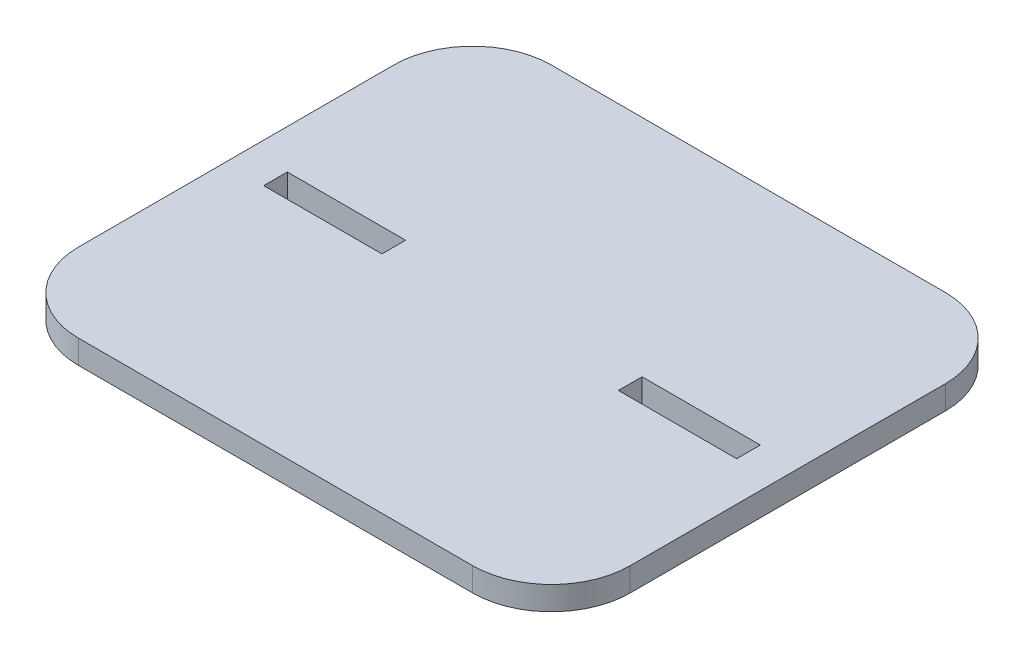
ISO-10303-21;
HEADER;
FILE_DESCRIPTION(('STEP AP214'),'2;1');
FILE_NAME('part.step','',(''),(''),'','','');
FILE_SCHEMA(('AUTOMOTIVE_DESIGN { 1 0 10303 214 1 1 1 1 }'));
ENDSEC;
DATA;
#1=APPLICATION_CONTEXT('core data for automotive mechanical design processes');
#2=APPLICATION_PROTOCOL_DEFINITION('international standard','automotive_design',2000,#1);
#3=PRODUCT_CONTEXT('',#1,'mechanical');
#4=PRODUCT('Part','Part','',(#3));
#5=PRODUCT_RELATED_PRODUCT_CATEGORY('part','',(#4));
#6=PRODUCT_DEFINITION_FORMATION('','',#4);
#7=PRODUCT_DEFINITION_CONTEXT('part definition',#1,'design');
#8=PRODUCT_DEFINITION('design','',#6,#7);
#9=PRODUCT_DEFINITION_SHAPE('','',#8);
#10=(LENGTH_UNIT() NAMED_UNIT(*) SI_UNIT(.MILLI.,.METRE.));
#11=(NAMED_UNIT(*) PLANE_ANGLE_UNIT() SI_UNIT($,.RADIAN.));
#12=(NAMED_UNIT(*) SI_UNIT($,.STERADIAN.) SOLID_ANGLE_UNIT());
#13=UNCERTAINTY_MEASURE_WITH_UNIT(LENGTH_MEASURE(1.E-05),#10,'distance_accuracy_value','');
#14=(GEOMETRIC_REPRESENTATION_CONTEXT(3) GLOBAL_UNCERTAINTY_ASSIGNED_CONTEXT((#13)) GLOBAL_UNIT_ASSIGNED_CONTEXT((#10,
#11,#12)) REPRESENTATION_CONTEXT('',''));
#15=CARTESIAN_POINT('',(0.,0.,0.));
#16=DIRECTION('',(0.,0.,1.));
#17=DIRECTION('',(1.,0.,0.));
#18=AXIS2_PLACEMENT_3D('',#15,#16,#17);
#19=CARTESIAN_POINT('',(60.,3.,-50.));
#20=DIRECTION('',(0.,-1.,0.));
#21=DIRECTION('',(0.,0.,-1.));
#22=AXIS2_PLACEMENT_3D('',#19,#20,#21);
#23=PLANE('',#22);
#24=DIRECTION('',(0.,0.,-1.));
#25=VECTOR('',#24,1.);
#26=CARTESIAN_POINT('',(20.,3.,-31.5));
#27=LINE('',#26,#25);
#28=CARTESIAN_POINT('',(20.,3.,-28.5));
#29=VERTEX_POINT('',#28);
#30=CARTESIAN_POINT('',(20.,3.,-31.5));
#31=VERTEX_POINT('',#30);
#32=EDGE_CURVE('E182',#29,#31,#27,.T.);
#33=ORIENTED_EDGE('',*,*,#32,.F.);
#34=DIRECTION('',(1.,0.,0.));
#35=VECTOR('',#34,1.);
#36=CARTESIAN_POINT('',(5.,3.,-28.5));
#37=LINE('',#36,#35);
#38=CARTESIAN_POINT('',(5.,3.,-28.5));
#39=VERTEX_POINT('',#38);
#40=EDGE_CURVE('E190',#39,#29,#37,.T.);
#41=ORIENTED_EDGE('',*,*,#40,.F.);
#42=DIRECTION('',(0.,0.,1.));
#43=VECTOR('',#42,1.);
#44=CARTESIAN_POINT('',(5.,3.,-31.5));
#45=LINE('',#44,#43);
#46=CARTESIAN_POINT('',(5.,3.,-31.5));
#47=VERTEX_POINT('',#46);
#48=EDGE_CURVE('E187',#47,#39,#45,.T.);
#49=ORIENTED_EDGE('',*,*,#48,.F.);
#50=DIRECTION('',(-1.,0.,0.));
#51=VECTOR('',#50,1.);
#52=CARTESIAN_POINT('',(5.,3.,-31.5));
#53=LINE('',#52,#51);
#54=EDGE_CURVE('E184',#31,#47,#53,.T.);
#55=ORIENTED_EDGE('',*,*,#54,.F.);
#56=EDGE_LOOP('',(#33,#41,#49,#55));
#57=FACE_BOUND('',#56,.T.);
#58=CARTESIAN_POINT('',(60.,3.,-50.));
#59=DIRECTION('',(0.,1.,0.));
#60=DIRECTION('',(0.,0.,-1.));
#61=AXIS2_PLACEMENT_3D('',#58,#59,#60);
#62=CIRCLE('',#61,10.);
#63=CARTESIAN_POINT('',(70.,3.,-50.));
#64=VERTEX_POINT('',#63);
#65=CARTESIAN_POINT('',(60.,3.,-60.));
#66=VERTEX_POINT('',#65);
#67=EDGE_CURVE('E213',#64,#66,#62,.T.);
#68=ORIENTED_EDGE('',*,*,#67,.T.);
#69=DIRECTION('',(-1.,0.,0.));
#70=VECTOR('',#69,1.);
#71=CARTESIAN_POINT('',(10.0000000000001,3.,-60.));
#72=LINE('',#71,#70);
#73=CARTESIAN_POINT('',(10.0000000000001,3.,-60.));
#74=VERTEX_POINT('',#73);
#75=EDGE_CURVE('E216',#66,#74,#72,.T.);
#76=ORIENTED_EDGE('',*,*,#75,.T.);
#77=CARTESIAN_POINT('',(10.,3.,-50.));
#78=DIRECTION('',(0.,1.,0.));
#79=DIRECTION('',(0.,0.,-1.));
#80=AXIS2_PLACEMENT_3D('',#77,#78,#79);
#81=CIRCLE('',#80,10.);
#82=CARTESIAN_POINT('',(0.,3.,-49.9999999999999));
#83=VERTEX_POINT('',#82);
#84=EDGE_CURVE('E219',#74,#83,#81,.T.);
#85=ORIENTED_EDGE('',*,*,#84,.T.);
#86=DIRECTION('',(0.,0.,1.));
#87=VECTOR('',#86,1.);
#88=CARTESIAN_POINT('',(0.,3.,-10.0000000000001));
#89=LINE('',#88,#87);
#90=CARTESIAN_POINT('',(0.,3.,-10.0000000000001));
#91=VERTEX_POINT('',#90);
#92=EDGE_CURVE('E221',#83,#91,#89,.T.);
#93=ORIENTED_EDGE('',*,*,#92,.T.);
#94=CARTESIAN_POINT('',(10.,3.,-10.));
#95=DIRECTION('',(0.,1.,0.));
#96=DIRECTION('',(0.,0.,-1.));
#97=AXIS2_PLACEMENT_3D('',#94,#95,#96);
#98=CIRCLE('',#97,10.);
#99=CARTESIAN_POINT('',(10.0000000000001,3.,0.));
#100=VERTEX_POINT('',#99);
#101=EDGE_CURVE('E223',#91,#100,#98,.T.);
#102=ORIENTED_EDGE('',*,*,#101,.T.);
#103=DIRECTION('',(1.,0.,0.));
#104=VECTOR('',#103,1.);
#105=CARTESIAN_POINT('',(10.0000000000001,3.,0.));
#106=LINE('',#105,#104);
#107=CARTESIAN_POINT('',(60.,3.,0.));
#108=VERTEX_POINT('',#107);
#109=EDGE_CURVE('E225',#100,#108,#106,.T.);
#110=ORIENTED_EDGE('',*,*,#109,.T.);
#111=CARTESIAN_POINT('',(60.,3.,-10.));
#112=DIRECTION('',(0.,1.,0.));
#113=DIRECTION('',(0.,0.,1.));
#114=AXIS2_PLACEMENT_3D('',#111,#112,#113);
#115=CIRCLE('',#114,10.);
#116=CARTESIAN_POINT('',(70.,3.,-10.));
#117=VERTEX_POINT('',#116);
#118=EDGE_CURVE('E227',#108,#117,#115,.T.);
#119=ORIENTED_EDGE('',*,*,#118,.T.);
#120=DIRECTION('',(0.,0.,-1.));
#121=VECTOR('',#120,1.);
#122=CARTESIAN_POINT('',(70.,3.,-10.));
#123=LINE('',#122,#121);
#124=EDGE_CURVE('E229',#117,#64,#123,.T.);
#125=ORIENTED_EDGE('',*,*,#124,.T.);
#126=EDGE_LOOP('',(#68,#76,#85,#93,#102,#110,#119,#125));
#127=FACE_BOUND('',#126,.T.);
#128=DIRECTION('',(0.,0.,-1.));
#129=VECTOR('',#128,1.);
#130=CARTESIAN_POINT('',(65.,3.,-31.5));
#131=LINE('',#130,#129);
#132=CARTESIAN_POINT('',(65.,3.,-28.5));
#133=VERTEX_POINT('',#132);
#134=CARTESIAN_POINT('',(65.,3.,-31.5));
#135=VERTEX_POINT('',#134);
#136=EDGE_CURVE('E146',#133,#135,#131,.T.);
#137=ORIENTED_EDGE('',*,*,#136,.F.);
#138=DIRECTION('',(1.,0.,0.));
#139=VECTOR('',#138,1.);
#140=CARTESIAN_POINT('',(50.,3.,-28.5));
#141=LINE('',#140,#139);
#142=CARTESIAN_POINT('',(50.,3.,-28.5));
#143=VERTEX_POINT('',#142);
#144=EDGE_CURVE('E168',#143,#133,#141,.T.);
#145=ORIENTED_EDGE('',*,*,#144,.F.);
#146=DIRECTION('',(0.,0.,1.));
#147=VECTOR('',#146,1.);
#148=CARTESIAN_POINT('',(50.,3.,-31.5));
#149=LINE('',#148,#147);
#150=CARTESIAN_POINT('',(50.,3.,-31.5));
#151=VERTEX_POINT('',#150);
#152=EDGE_CURVE('E166',#151,#143,#149,.T.);
#153=ORIENTED_EDGE('',*,*,#152,.F.);
#154=DIRECTION('',(-1.,0.,0.));
#155=VECTOR('',#154,1.);
#156=CARTESIAN_POINT('',(50.,3.,-31.5));
#157=LINE('',#156,#155);
#158=EDGE_CURVE('E154',#135,#151,#157,.T.);
#159=ORIENTED_EDGE('',*,*,#158,.F.);
#160=EDGE_LOOP('',(#137,#145,#153,#159));
#161=FACE_BOUND('',#160,.T.);
#162=ADVANCED_FACE('F33',(#57,#127,#161),#23,.F.);
#163=CARTESIAN_POINT('',(60.,0.,-50.));
#164=DIRECTION('',(0.,-1.,0.));
#165=DIRECTION('',(0.,0.,-1.));
#166=AXIS2_PLACEMENT_3D('',#163,#164,#165);
#167=PLANE('',#166);
#168=CARTESIAN_POINT('',(60.,0.,-50.));
#169=DIRECTION('',(0.,1.,0.));
#170=DIRECTION('',(0.,0.,-1.));
#171=AXIS2_PLACEMENT_3D('',#168,#169,#170);
#172=CIRCLE('',#171,10.);
#173=CARTESIAN_POINT('',(70.,0.,-50.));
#174=VERTEX_POINT('',#173);
#175=CARTESIAN_POINT('',(60.,0.,-60.));
#176=VERTEX_POINT('',#175);
#177=EDGE_CURVE('E212',#174,#176,#172,.T.);
#178=ORIENTED_EDGE('',*,*,#177,.F.);
#179=DIRECTION('',(0.,0.,-1.));
#180=VECTOR('',#179,1.);
#181=CARTESIAN_POINT('',(70.,0.,-10.));
#182=LINE('',#181,#180);
#183=CARTESIAN_POINT('',(70.,0.,-10.));
#184=VERTEX_POINT('',#183);
#185=EDGE_CURVE('E217',#184,#174,#182,.T.);
#186=ORIENTED_EDGE('',*,*,#185,.F.);
#187=CARTESIAN_POINT('',(60.,0.,-10.));
#188=DIRECTION('',(0.,1.,0.));
#189=DIRECTION('',(0.,0.,1.));
#190=AXIS2_PLACEMENT_3D('',#187,#188,#189);
#191=CIRCLE('',#190,10.);
#192=CARTESIAN_POINT('',(60.,0.,0.));
#193=VERTEX_POINT('',#192);
#194=EDGE_CURVE('E244',#193,#184,#191,.T.);
#195=ORIENTED_EDGE('',*,*,#194,.F.);
#196=DIRECTION('',(1.,0.,0.));
#197=VECTOR('',#196,1.);
#198=CARTESIAN_POINT('',(10.0000000000001,0.,0.));
#199=LINE('',#198,#197);
#200=CARTESIAN_POINT('',(10.0000000000001,0.,0.));
#201=VERTEX_POINT('',#200);
#202=EDGE_CURVE('E242',#201,#193,#199,.T.);
#203=ORIENTED_EDGE('',*,*,#202,.F.);
#204=CARTESIAN_POINT('',(10.,0.,-10.));
#205=DIRECTION('',(0.,1.,0.));
#206=DIRECTION('',(0.,0.,-1.));
#207=AXIS2_PLACEMENT_3D('',#204,#205,#206);
#208=CIRCLE('',#207,10.);
#209=CARTESIAN_POINT('',(0.,0.,-10.0000000000001));
#210=VERTEX_POINT('',#209);
#211=EDGE_CURVE('E240',#210,#201,#208,.T.);
#212=ORIENTED_EDGE('',*,*,#211,.F.);
#213=DIRECTION('',(0.,0.,1.));
#214=VECTOR('',#213,1.);
#215=CARTESIAN_POINT('',(0.,0.,-10.0000000000001));
#216=LINE('',#215,#214);
#217=CARTESIAN_POINT('',(0.,0.,-49.9999999999999));
#218=VERTEX_POINT('',#217);
#219=EDGE_CURVE('E238',#218,#210,#216,.T.);
#220=ORIENTED_EDGE('',*,*,#219,.F.);
#221=CARTESIAN_POINT('',(10.,0.,-50.));
#222=DIRECTION('',(0.,1.,0.));
#223=DIRECTION('',(0.,0.,-1.));
#224=AXIS2_PLACEMENT_3D('',#221,#222,#223);
#225=CIRCLE('',#224,10.);
#226=CARTESIAN_POINT('',(10.0000000000001,0.,-60.));
#227=VERTEX_POINT('',#226);
#228=EDGE_CURVE('E236',#227,#218,#225,.T.);
#229=ORIENTED_EDGE('',*,*,#228,.F.);
#230=DIRECTION('',(-1.,0.,0.));
#231=VECTOR('',#230,1.);
#232=CARTESIAN_POINT('',(10.0000000000001,0.,-60.));
#233=LINE('',#232,#231);
#234=EDGE_CURVE('E234',#176,#227,#233,.T.);
#235=ORIENTED_EDGE('',*,*,#234,.F.);
#236=EDGE_LOOP('',(#178,#186,#195,#203,#212,#220,#229,#235));
#237=FACE_BOUND('',#236,.T.);
#238=DIRECTION('',(1.,0.,0.));
#239=VECTOR('',#238,1.);
#240=CARTESIAN_POINT('',(5.,0.,-28.5));
#241=LINE('',#240,#239);
#242=CARTESIAN_POINT('',(5.,0.,-28.5));
#243=VERTEX_POINT('',#242);
#244=CARTESIAN_POINT('',(20.,0.,-28.5));
#245=VERTEX_POINT('',#244);
#246=EDGE_CURVE('E185',#243,#245,#241,.T.);
#247=ORIENTED_EDGE('',*,*,#246,.T.);
#248=DIRECTION('',(0.,0.,-1.));
#249=VECTOR('',#248,1.);
#250=CARTESIAN_POINT('',(20.,0.,-31.5));
#251=LINE('',#250,#249);
#252=CARTESIAN_POINT('',(20.,0.,-31.5));
#253=VERTEX_POINT('',#252);
#254=EDGE_CURVE('E162',#245,#253,#251,.T.);
#255=ORIENTED_EDGE('',*,*,#254,.T.);
#256=DIRECTION('',(-1.,0.,0.));
#257=VECTOR('',#256,1.);
#258=CARTESIAN_POINT('',(5.,0.,-31.5));
#259=LINE('',#258,#257);
#260=CARTESIAN_POINT('',(5.,0.,-31.5));
#261=VERTEX_POINT('',#260);
#262=EDGE_CURVE('E195',#253,#261,#259,.T.);
#263=ORIENTED_EDGE('',*,*,#262,.T.);
#264=DIRECTION('',(0.,0.,1.));
#265=VECTOR('',#264,1.);
#266=CARTESIAN_POINT('',(5.,0.,-31.5));
#267=LINE('',#266,#265);
#268=EDGE_CURVE('E198',#261,#243,#267,.T.);
#269=ORIENTED_EDGE('',*,*,#268,.T.);
#270=EDGE_LOOP('',(#247,#255,#263,#269));
#271=FACE_BOUND('',#270,.T.);
#272=DIRECTION('',(1.,0.,0.));
#273=VECTOR('',#272,1.);
#274=CARTESIAN_POINT('',(50.,0.,-28.5));
#275=LINE('',#274,#273);
#276=CARTESIAN_POINT('',(50.,0.,-28.5));
#277=VERTEX_POINT('',#276);
#278=CARTESIAN_POINT('',(65.,0.,-28.5));
#279=VERTEX_POINT('',#278);
#280=EDGE_CURVE('E155',#277,#279,#275,.T.);
#281=ORIENTED_EDGE('',*,*,#280,.T.);
#282=DIRECTION('',(0.,0.,-1.));
#283=VECTOR('',#282,1.);
#284=CARTESIAN_POINT('',(65.,0.,-31.5));
#285=LINE('',#284,#283);
#286=CARTESIAN_POINT('',(65.,0.,-31.5));
#287=VERTEX_POINT('',#286);
#288=EDGE_CURVE('E56',#279,#287,#285,.T.);
#289=ORIENTED_EDGE('',*,*,#288,.T.);
#290=DIRECTION('',(-1.,0.,0.));
#291=VECTOR('',#290,1.);
#292=CARTESIAN_POINT('',(50.,0.,-31.5));
#293=LINE('',#292,#291);
#294=CARTESIAN_POINT('',(50.,0.,-31.5));
#295=VERTEX_POINT('',#294);
#296=EDGE_CURVE('E161',#287,#295,#293,.T.);
#297=ORIENTED_EDGE('',*,*,#296,.T.);
#298=DIRECTION('',(0.,0.,1.));
#299=VECTOR('',#298,1.);
#300=CARTESIAN_POINT('',(50.,0.,-31.5));
#301=LINE('',#300,#299);
#302=EDGE_CURVE('E174',#295,#277,#301,.T.);
#303=ORIENTED_EDGE('',*,*,#302,.T.);
#304=EDGE_LOOP('',(#281,#289,#297,#303));
#305=FACE_BOUND('',#304,.T.);
#306=ADVANCED_FACE('F274',(#237,#271,#305),#167,.T.);
#307=CARTESIAN_POINT('',(60.,3.,-50.));
#308=DIRECTION('',(0.,-1.,0.));
#309=DIRECTION('',(0.,0.,-1.));
#310=AXIS2_PLACEMENT_3D('',#307,#308,#309);
#311=CYLINDRICAL_SURFACE('',#310,10.);
#312=ORIENTED_EDGE('',*,*,#177,.T.);
#313=DIRECTION('',(0.,-1.,0.));
#314=VECTOR('',#313,1.);
#315=CARTESIAN_POINT('',(60.,3.,-60.));
#316=LINE('',#315,#314);
#317=EDGE_CURVE('E11',#66,#176,#316,.T.);
#318=ORIENTED_EDGE('',*,*,#317,.F.);
#319=ORIENTED_EDGE('',*,*,#67,.F.);
#320=DIRECTION('',(0.,-1.,0.));
#321=VECTOR('',#320,1.);
#322=CARTESIAN_POINT('',(70.,3.,-50.));
#323=LINE('',#322,#321);
#324=EDGE_CURVE('E231',#64,#174,#323,.T.);
#325=ORIENTED_EDGE('',*,*,#324,.T.);
#326=EDGE_LOOP('',(#312,#318,#319,#325));
#327=FACE_BOUND('',#326,.T.);
#328=ADVANCED_FACE('F35',(#327),#311,.T.);
#329=CARTESIAN_POINT('',(10.0000000000001,3.,-60.));
#330=DIRECTION('',(0.,0.,1.));
#331=DIRECTION('',(1.,0.,0.));
#332=AXIS2_PLACEMENT_3D('',#329,#330,#331);
#333=PLANE('',#332);
#334=ORIENTED_EDGE('',*,*,#234,.T.);
#335=DIRECTION('',(0.,-1.,0.));
#336=VECTOR('',#335,1.);
#337=CARTESIAN_POINT('',(10.0000000000001,3.,-60.));
#338=LINE('',#337,#336);
#339=EDGE_CURVE('E41',#74,#227,#338,.T.);
#340=ORIENTED_EDGE('',*,*,#339,.F.);
#341=ORIENTED_EDGE('',*,*,#75,.F.);
#342=ORIENTED_EDGE('',*,*,#317,.T.);
#343=EDGE_LOOP('',(#334,#340,#341,#342));
#344=FACE_BOUND('',#343,.T.);
#345=ADVANCED_FACE('F291',(#344),#333,.F.);
#346=CARTESIAN_POINT('',(10.,3.,-50.));
#347=DIRECTION('',(0.,-1.,0.));
#348=DIRECTION('',(0.,0.,-1.));
#349=AXIS2_PLACEMENT_3D('',#346,#347,#348);
#350=CYLINDRICAL_SURFACE('',#349,10.);
#351=ORIENTED_EDGE('',*,*,#228,.T.);
#352=DIRECTION('',(0.,-1.,0.));
#353=VECTOR('',#352,1.);
#354=CARTESIAN_POINT('',(0.,3.,-49.9999999999999));
#355=LINE('',#354,#353);
#356=EDGE_CURVE('E261',#83,#218,#355,.T.);
#357=ORIENTED_EDGE('',*,*,#356,.F.);
#358=ORIENTED_EDGE('',*,*,#84,.F.);
#359=ORIENTED_EDGE('',*,*,#339,.T.);
#360=EDGE_LOOP('',(#351,#357,#358,#359));
#361=FACE_BOUND('',#360,.T.);
#362=ADVANCED_FACE('F268',(#361),#350,.T.);
#363=CARTESIAN_POINT('',(0.,3.,-10.0000000000001));
#364=DIRECTION('',(1.,0.,0.));
#365=DIRECTION('',(0.,0.,-1.));
#366=AXIS2_PLACEMENT_3D('',#363,#364,#365);
#367=PLANE('',#366);
#368=ORIENTED_EDGE('',*,*,#219,.T.);
#369=DIRECTION('',(0.,-1.,0.));
#370=VECTOR('',#369,1.);
#371=CARTESIAN_POINT('',(0.,3.,-10.0000000000001));
#372=LINE('',#371,#370);
#373=EDGE_CURVE('E258',#91,#210,#372,.T.);
#374=ORIENTED_EDGE('',*,*,#373,.F.);
#375=ORIENTED_EDGE('',*,*,#92,.F.);
#376=ORIENTED_EDGE('',*,*,#356,.T.);
#377=EDGE_LOOP('',(#368,#374,#375,#376));
#378=FACE_BOUND('',#377,.T.);
#379=ADVANCED_FACE('F280',(#378),#367,.F.);
#380=CARTESIAN_POINT('',(10.,3.,-10.));
#381=DIRECTION('',(0.,-1.,0.));
#382=DIRECTION('',(0.,0.,-1.));
#383=AXIS2_PLACEMENT_3D('',#380,#381,#382);
#384=CYLINDRICAL_SURFACE('',#383,10.);
#385=ORIENTED_EDGE('',*,*,#211,.T.);
#386=DIRECTION('',(0.,-1.,0.));
#387=VECTOR('',#386,1.);
#388=CARTESIAN_POINT('',(10.0000000000001,3.,0.));
#389=LINE('',#388,#387);
#390=EDGE_CURVE('E255',#100,#201,#389,.T.);
#391=ORIENTED_EDGE('',*,*,#390,.F.);
#392=ORIENTED_EDGE('',*,*,#101,.F.);
#393=ORIENTED_EDGE('',*,*,#373,.T.);
#394=EDGE_LOOP('',(#385,#391,#392,#393));
#395=FACE_BOUND('',#394,.T.);
#396=ADVANCED_FACE('F284',(#395),#384,.T.);
#397=CARTESIAN_POINT('',(10.0000000000001,3.,0.));
#398=DIRECTION('',(0.,0.,-1.));
#399=DIRECTION('',(-1.,0.,0.));
#400=AXIS2_PLACEMENT_3D('',#397,#398,#399);
#401=PLANE('',#400);
#402=ORIENTED_EDGE('',*,*,#202,.T.);
#403=DIRECTION('',(0.,-1.,0.));
#404=VECTOR('',#403,1.);
#405=CARTESIAN_POINT('',(60.,3.,0.));
#406=LINE('',#405,#404);
#407=EDGE_CURVE('E252',#108,#193,#406,.T.);
#408=ORIENTED_EDGE('',*,*,#407,.F.);
#409=ORIENTED_EDGE('',*,*,#109,.F.);
#410=ORIENTED_EDGE('',*,*,#390,.T.);
#411=EDGE_LOOP('',(#402,#408,#409,#410));
#412=FACE_BOUND('',#411,.T.);
#413=ADVANCED_FACE('F304',(#412),#401,.F.);
#414=CARTESIAN_POINT('',(60.,3.,-10.));
#415=DIRECTION('',(0.,-1.,0.));
#416=DIRECTION('',(0.,0.,-1.));
#417=AXIS2_PLACEMENT_3D('',#414,#415,#416);
#418=CYLINDRICAL_SURFACE('',#417,10.);
#419=ORIENTED_EDGE('',*,*,#194,.T.);
#420=DIRECTION('',(0.,-1.,0.));
#421=VECTOR('',#420,1.);
#422=CARTESIAN_POINT('',(70.,3.,-10.));
#423=LINE('',#422,#421);
#424=EDGE_CURVE('E249',#117,#184,#423,.T.);
#425=ORIENTED_EDGE('',*,*,#424,.F.);
#426=ORIENTED_EDGE('',*,*,#118,.F.);
#427=ORIENTED_EDGE('',*,*,#407,.T.);
#428=EDGE_LOOP('',(#419,#425,#426,#427));
#429=FACE_BOUND('',#428,.T.);
#430=ADVANCED_FACE('F302',(#429),#418,.T.);
#431=CARTESIAN_POINT('',(70.,3.,-10.));
#432=DIRECTION('',(-1.,0.,0.));
#433=DIRECTION('',(0.,0.,1.));
#434=AXIS2_PLACEMENT_3D('',#431,#432,#433);
#435=PLANE('',#434);
#436=ORIENTED_EDGE('',*,*,#185,.T.);
#437=ORIENTED_EDGE('',*,*,#324,.F.);
#438=ORIENTED_EDGE('',*,*,#124,.F.);
#439=ORIENTED_EDGE('',*,*,#424,.T.);
#440=EDGE_LOOP('',(#436,#437,#438,#439));
#441=FACE_BOUND('',#440,.T.);
#442=ADVANCED_FACE('F297',(#441),#435,.F.);
#443=CARTESIAN_POINT('',(20.,3.,-31.5));
#444=DIRECTION('',(-1.,0.,0.));
#445=DIRECTION('',(0.,0.,1.));
#446=AXIS2_PLACEMENT_3D('',#443,#444,#445);
#447=PLANE('',#446);
#448=ORIENTED_EDGE('',*,*,#254,.F.);
#449=DIRECTION('',(0.,-1.,0.));
#450=VECTOR('',#449,1.);
#451=CARTESIAN_POINT('',(20.,3.,-28.5));
#452=LINE('',#451,#450);
#453=EDGE_CURVE('E192',#29,#245,#452,.T.);
#454=ORIENTED_EDGE('',*,*,#453,.F.);
#455=ORIENTED_EDGE('',*,*,#32,.T.);
#456=DIRECTION('',(0.,-1.,0.));
#457=VECTOR('',#456,1.);
#458=CARTESIAN_POINT('',(20.,3.,-31.5));
#459=LINE('',#458,#457);
#460=EDGE_CURVE('E209',#31,#253,#459,.T.);
#461=ORIENTED_EDGE('',*,*,#460,.T.);
#462=EDGE_LOOP('',(#448,#454,#455,#461));
#463=FACE_BOUND('',#462,.T.);
#464=ADVANCED_FACE('F322',(#463),#447,.T.);
#465=CARTESIAN_POINT('',(5.,3.,-31.5));
#466=DIRECTION('',(0.,0.,1.));
#467=DIRECTION('',(1.,0.,0.));
#468=AXIS2_PLACEMENT_3D('',#465,#466,#467);
#469=PLANE('',#468);
#470=ORIENTED_EDGE('',*,*,#262,.F.);
#471=ORIENTED_EDGE('',*,*,#460,.F.);
#472=ORIENTED_EDGE('',*,*,#54,.T.);
#473=DIRECTION('',(0.,-1.,0.));
#474=VECTOR('',#473,1.);
#475=CARTESIAN_POINT('',(5.,3.,-31.5));
#476=LINE('',#475,#474);
#477=EDGE_CURVE('E207',#47,#261,#476,.T.);
#478=ORIENTED_EDGE('',*,*,#477,.T.);
#479=EDGE_LOOP('',(#470,#471,#472,#478));
#480=FACE_BOUND('',#479,.T.);
#481=ADVANCED_FACE('F329',(#480),#469,.T.);
#482=CARTESIAN_POINT('',(5.,3.,-31.5));
#483=DIRECTION('',(1.,0.,0.));
#484=DIRECTION('',(0.,0.,-1.));
#485=AXIS2_PLACEMENT_3D('',#482,#483,#484);
#486=PLANE('',#485);
#487=ORIENTED_EDGE('',*,*,#268,.F.);
#488=ORIENTED_EDGE('',*,*,#477,.F.);
#489=ORIENTED_EDGE('',*,*,#48,.T.);
#490=DIRECTION('',(0.,-1.,0.));
#491=VECTOR('',#490,1.);
#492=CARTESIAN_POINT('',(5.,3.,-28.5));
#493=LINE('',#492,#491);
#494=EDGE_CURVE('E205',#39,#243,#493,.T.);
#495=ORIENTED_EDGE('',*,*,#494,.T.);
#496=EDGE_LOOP('',(#487,#488,#489,#495));
#497=FACE_BOUND('',#496,.T.);
#498=ADVANCED_FACE('F334',(#497),#486,.T.);
#499=CARTESIAN_POINT('',(5.,3.,-28.5));
#500=DIRECTION('',(0.,0.,-1.));
#501=DIRECTION('',(-1.,0.,0.));
#502=AXIS2_PLACEMENT_3D('',#499,#500,#501);
#503=PLANE('',#502);
#504=ORIENTED_EDGE('',*,*,#246,.F.);
#505=ORIENTED_EDGE('',*,*,#494,.F.);
#506=ORIENTED_EDGE('',*,*,#40,.T.);
#507=ORIENTED_EDGE('',*,*,#453,.T.);
#508=EDGE_LOOP('',(#504,#505,#506,#507));
#509=FACE_BOUND('',#508,.T.);
#510=ADVANCED_FACE('F340',(#509),#503,.T.);
#511=CARTESIAN_POINT('',(65.,3.,-31.5));
#512=DIRECTION('',(-1.,0.,0.));
#513=DIRECTION('',(0.,0.,1.));
#514=AXIS2_PLACEMENT_3D('',#511,#512,#513);
#515=PLANE('',#514);
#516=ORIENTED_EDGE('',*,*,#288,.F.);
#517=DIRECTION('',(0.,-1.,0.));
#518=VECTOR('',#517,1.);
#519=CARTESIAN_POINT('',(65.,3.,-28.5));
#520=LINE('',#519,#518);
#521=EDGE_CURVE('E150',#133,#279,#520,.T.);
#522=ORIENTED_EDGE('',*,*,#521,.F.);
#523=ORIENTED_EDGE('',*,*,#136,.T.);
#524=DIRECTION('',(0.,-1.,0.));
#525=VECTOR('',#524,1.);
#526=CARTESIAN_POINT('',(65.,3.,-31.5));
#527=LINE('',#526,#525);
#528=EDGE_CURVE('E149',#135,#287,#527,.T.);
#529=ORIENTED_EDGE('',*,*,#528,.T.);
#530=EDGE_LOOP('',(#516,#522,#523,#529));
#531=FACE_BOUND('',#530,.T.);
#532=ADVANCED_FACE('F148',(#531),#515,.T.);
#533=CARTESIAN_POINT('',(50.,3.,-31.5));
#534=DIRECTION('',(0.,0.,1.));
#535=DIRECTION('',(1.,0.,0.));
#536=AXIS2_PLACEMENT_3D('',#533,#534,#535);
#537=PLANE('',#536);
#538=ORIENTED_EDGE('',*,*,#296,.F.);
#539=ORIENTED_EDGE('',*,*,#528,.F.);
#540=ORIENTED_EDGE('',*,*,#158,.T.);
#541=DIRECTION('',(0.,-1.,0.));
#542=VECTOR('',#541,1.);
#543=CARTESIAN_POINT('',(50.,3.,-31.5));
#544=LINE('',#543,#542);
#545=EDGE_CURVE('E163',#151,#295,#544,.T.);
#546=ORIENTED_EDGE('',*,*,#545,.T.);
#547=EDGE_LOOP('',(#538,#539,#540,#546));
#548=FACE_BOUND('',#547,.T.);
#549=ADVANCED_FACE('F158',(#548),#537,.T.);
#550=CARTESIAN_POINT('',(50.,3.,-31.5));
#551=DIRECTION('',(1.,0.,0.));
#552=DIRECTION('',(0.,0.,-1.));
#553=AXIS2_PLACEMENT_3D('',#550,#551,#552);
#554=PLANE('',#553);
#555=ORIENTED_EDGE('',*,*,#302,.F.);
#556=ORIENTED_EDGE('',*,*,#545,.F.);
#557=ORIENTED_EDGE('',*,*,#152,.T.);
#558=DIRECTION('',(0.,-1.,0.));
#559=VECTOR('',#558,1.);
#560=CARTESIAN_POINT('',(50.,3.,-28.5));
#561=LINE('',#560,#559);
#562=EDGE_CURVE('E48',#143,#277,#561,.T.);
#563=ORIENTED_EDGE('',*,*,#562,.T.);
#564=EDGE_LOOP('',(#555,#556,#557,#563));
#565=FACE_BOUND('',#564,.T.);
#566=ADVANCED_FACE('F359',(#565),#554,.T.);
#567=CARTESIAN_POINT('',(50.,3.,-28.5));
#568=DIRECTION('',(0.,0.,-1.));
#569=DIRECTION('',(-1.,0.,0.));
#570=AXIS2_PLACEMENT_3D('',#567,#568,#569);
#571=PLANE('',#570);
#572=ORIENTED_EDGE('',*,*,#280,.F.);
#573=ORIENTED_EDGE('',*,*,#562,.F.);
#574=ORIENTED_EDGE('',*,*,#144,.T.);
#575=ORIENTED_EDGE('',*,*,#521,.T.);
#576=EDGE_LOOP('',(#572,#573,#574,#575));
#577=FACE_BOUND('',#576,.T.);
#578=ADVANCED_FACE('F362',(#577),#571,.T.);
#579=CLOSED_SHELL('',(#162,#306,#328,#345,#362,#379,#396,#413,#430,#442,#464,#481,#498,#510,
#532,#549,#566,#578));
#580=MANIFOLD_SOLID_BREP('B2',#579);
#581=ADVANCED_BREP_SHAPE_REPRESENTATION('',(#18,#580),#14);
#582=SHAPE_DEFINITION_REPRESENTATION(#9,#581);
ENDSEC;
END-ISO-10303-21;
